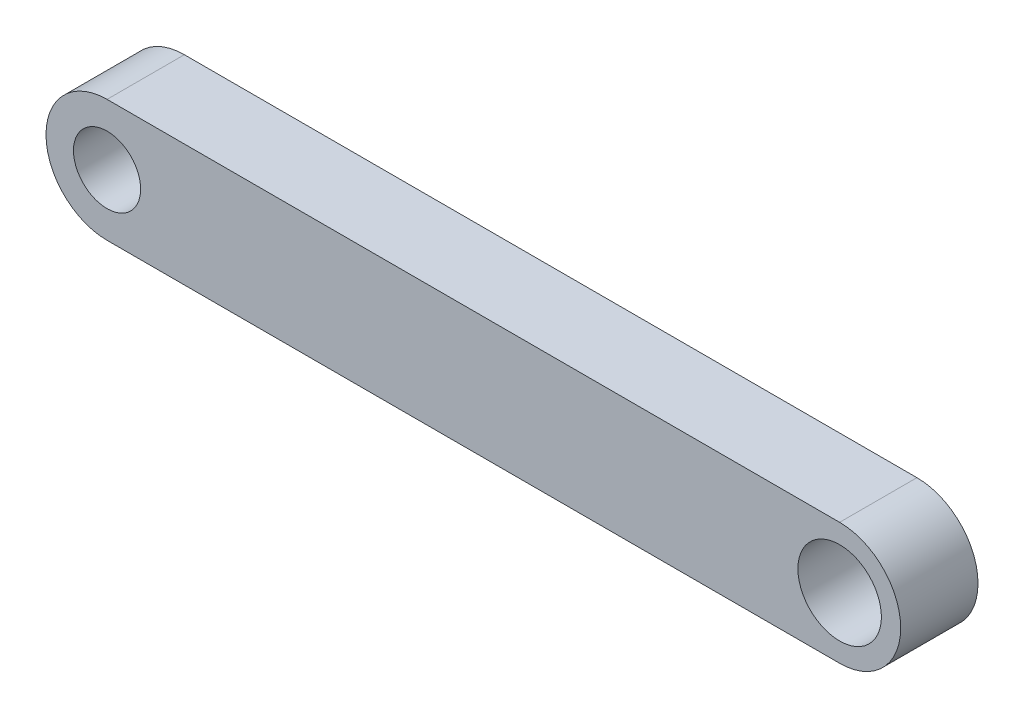
ISO-10303-21;
HEADER;
FILE_DESCRIPTION(('STEP AP214'),'2;1');
FILE_NAME('part.step','',(''),(''),'','','');
FILE_SCHEMA(('AUTOMOTIVE_DESIGN { 1 0 10303 214 1 1 1 1 }'));
ENDSEC;
DATA;
#1=APPLICATION_CONTEXT('core data for automotive mechanical design processes');
#2=APPLICATION_PROTOCOL_DEFINITION('international standard','automotive_design',2000,#1);
#3=PRODUCT_CONTEXT('',#1,'mechanical');
#4=PRODUCT('Part','Part','',(#3));
#5=PRODUCT_RELATED_PRODUCT_CATEGORY('part','',(#4));
#6=PRODUCT_DEFINITION_FORMATION('','',#4);
#7=PRODUCT_DEFINITION_CONTEXT('part definition',#1,'design');
#8=PRODUCT_DEFINITION('design','',#6,#7);
#9=PRODUCT_DEFINITION_SHAPE('','',#8);
#10=(LENGTH_UNIT() NAMED_UNIT(*) SI_UNIT(.MILLI.,.METRE.));
#11=(NAMED_UNIT(*) PLANE_ANGLE_UNIT() SI_UNIT($,.RADIAN.));
#12=(NAMED_UNIT(*) SI_UNIT($,.STERADIAN.) SOLID_ANGLE_UNIT());
#13=UNCERTAINTY_MEASURE_WITH_UNIT(LENGTH_MEASURE(1.E-05),#10,'distance_accuracy_value','');
#14=(GEOMETRIC_REPRESENTATION_CONTEXT(3) GLOBAL_UNCERTAINTY_ASSIGNED_CONTEXT((#13)) GLOBAL_UNIT_ASSIGNED_CONTEXT((#10,
#11,#12)) REPRESENTATION_CONTEXT('',''));
#15=CARTESIAN_POINT('',(0.,0.,0.));
#16=DIRECTION('',(0.,0.,1.));
#17=DIRECTION('',(1.,0.,0.));
#18=AXIS2_PLACEMENT_3D('',#15,#16,#17);
#19=CARTESIAN_POINT('',(-36.,0.,3.8));
#20=DIRECTION('',(0.,0.,-1.));
#21=DIRECTION('',(-1.,0.,0.));
#22=AXIS2_PLACEMENT_3D('',#19,#20,#21);
#23=PLANE('',#22);
#24=CARTESIAN_POINT('',(-36.,0.,3.8));
#25=DIRECTION('',(0.,0.,1.));
#26=DIRECTION('',(-1.,0.,0.));
#27=AXIS2_PLACEMENT_3D('',#24,#25,#26);
#28=CIRCLE('',#27,3.);
#29=CARTESIAN_POINT('',(-36.,3.,3.8));
#30=VERTEX_POINT('',#29);
#31=CARTESIAN_POINT('',(-36.,-3.,3.8));
#32=VERTEX_POINT('',#31);
#33=EDGE_CURVE('E98',#30,#32,#28,.T.);
#34=ORIENTED_EDGE('',*,*,#33,.T.);
#35=DIRECTION('',(1.,0.,0.));
#36=VECTOR('',#35,1.);
#37=CARTESIAN_POINT('',(0.,-3.,3.8));
#38=LINE('',#37,#36);
#39=CARTESIAN_POINT('',(0.,-3.,3.8));
#40=VERTEX_POINT('',#39);
#41=EDGE_CURVE('E93',#32,#40,#38,.T.);
#42=ORIENTED_EDGE('',*,*,#41,.T.);
#43=CARTESIAN_POINT('',(0.,0.,3.8));
#44=DIRECTION('',(0.,0.,1.));
#45=DIRECTION('',(1.,0.,0.));
#46=AXIS2_PLACEMENT_3D('',#43,#44,#45);
#47=CIRCLE('',#46,3.);
#48=CARTESIAN_POINT('',(0.,3.,3.8));
#49=VERTEX_POINT('',#48);
#50=EDGE_CURVE('E96',#40,#49,#47,.T.);
#51=ORIENTED_EDGE('',*,*,#50,.T.);
#52=DIRECTION('',(-1.,0.,0.));
#53=VECTOR('',#52,1.);
#54=CARTESIAN_POINT('',(0.,3.,3.8));
#55=LINE('',#54,#53);
#56=EDGE_CURVE('E63',#49,#30,#55,.T.);
#57=ORIENTED_EDGE('',*,*,#56,.T.);
#58=EDGE_LOOP('',(#34,#42,#51,#57));
#59=FACE_BOUND('',#58,.T.);
#60=CARTESIAN_POINT('',(0.,0.,3.8));
#61=DIRECTION('',(0.,0.,1.));
#62=DIRECTION('',(1.,0.,0.));
#63=AXIS2_PLACEMENT_3D('',#60,#61,#62);
#64=CIRCLE('',#63,2.05);
#65=CARTESIAN_POINT('',(-2.05,0.,3.8));
#66=VERTEX_POINT('',#65);
#67=EDGE_CURVE('E118',#66,#66,#64,.T.);
#68=ORIENTED_EDGE('',*,*,#67,.F.);
#69=EDGE_LOOP('',(#68));
#70=FACE_BOUND('',#69,.T.);
#71=CARTESIAN_POINT('',(-36.,0.,3.8));
#72=DIRECTION('',(0.,0.,1.));
#73=DIRECTION('',(-1.,0.,0.));
#74=AXIS2_PLACEMENT_3D('',#71,#72,#73);
#75=CIRCLE('',#74,1.65);
#76=CARTESIAN_POINT('',(-37.65,0.,3.8));
#77=VERTEX_POINT('',#76);
#78=EDGE_CURVE('E140',#77,#77,#75,.T.);
#79=ORIENTED_EDGE('',*,*,#78,.F.);
#80=EDGE_LOOP('',(#79));
#81=FACE_BOUND('',#80,.T.);
#82=ADVANCED_FACE('F45',(#59,#70,#81),#23,.F.);
#83=CARTESIAN_POINT('',(-36.,0.,0.));
#84=DIRECTION('',(0.,0.,-1.));
#85=DIRECTION('',(-1.,0.,0.));
#86=AXIS2_PLACEMENT_3D('',#83,#84,#85);
#87=PLANE('',#86);
#88=CARTESIAN_POINT('',(0.,0.,0.));
#89=DIRECTION('',(0.,0.,1.));
#90=DIRECTION('',(1.,0.,0.));
#91=AXIS2_PLACEMENT_3D('',#88,#89,#90);
#92=CIRCLE('',#91,2.05);
#93=CARTESIAN_POINT('',(-2.05,0.,0.));
#94=VERTEX_POINT('',#93);
#95=EDGE_CURVE('E136',#94,#94,#92,.T.);
#96=ORIENTED_EDGE('',*,*,#95,.T.);
#97=EDGE_LOOP('',(#96));
#98=FACE_BOUND('',#97,.T.);
#99=CARTESIAN_POINT('',(-36.,0.,0.));
#100=DIRECTION('',(0.,0.,1.));
#101=DIRECTION('',(-1.,0.,0.));
#102=AXIS2_PLACEMENT_3D('',#99,#100,#101);
#103=CIRCLE('',#102,3.);
#104=CARTESIAN_POINT('',(-36.,3.,0.));
#105=VERTEX_POINT('',#104);
#106=CARTESIAN_POINT('',(-36.,-3.,0.));
#107=VERTEX_POINT('',#106);
#108=EDGE_CURVE('E114',#105,#107,#103,.T.);
#109=ORIENTED_EDGE('',*,*,#108,.F.);
#110=DIRECTION('',(-1.,0.,0.));
#111=VECTOR('',#110,1.);
#112=CARTESIAN_POINT('',(0.,3.,0.));
#113=LINE('',#112,#111);
#114=CARTESIAN_POINT('',(0.,3.,0.));
#115=VERTEX_POINT('',#114);
#116=EDGE_CURVE('E86',#115,#105,#113,.T.);
#117=ORIENTED_EDGE('',*,*,#116,.F.);
#118=CARTESIAN_POINT('',(0.,0.,0.));
#119=DIRECTION('',(0.,0.,1.));
#120=DIRECTION('',(1.,0.,0.));
#121=AXIS2_PLACEMENT_3D('',#118,#119,#120);
#122=CIRCLE('',#121,3.);
#123=CARTESIAN_POINT('',(0.,-3.,0.));
#124=VERTEX_POINT('',#123);
#125=EDGE_CURVE('E80',#124,#115,#122,.T.);
#126=ORIENTED_EDGE('',*,*,#125,.F.);
#127=DIRECTION('',(1.,0.,0.));
#128=VECTOR('',#127,1.);
#129=CARTESIAN_POINT('',(0.,-3.,0.));
#130=LINE('',#129,#128);
#131=EDGE_CURVE('E103',#107,#124,#130,.T.);
#132=ORIENTED_EDGE('',*,*,#131,.F.);
#133=EDGE_LOOP('',(#109,#117,#126,#132));
#134=FACE_BOUND('',#133,.T.);
#135=CARTESIAN_POINT('',(-36.,0.,0.));
#136=DIRECTION('',(0.,0.,1.));
#137=DIRECTION('',(-1.,0.,0.));
#138=AXIS2_PLACEMENT_3D('',#135,#136,#137);
#139=CIRCLE('',#138,1.65);
#140=CARTESIAN_POINT('',(-37.65,0.,0.));
#141=VERTEX_POINT('',#140);
#142=EDGE_CURVE('E144',#141,#141,#139,.T.);
#143=ORIENTED_EDGE('',*,*,#142,.T.);
#144=EDGE_LOOP('',(#143));
#145=FACE_BOUND('',#144,.T.);
#146=ADVANCED_FACE('F131',(#98,#134,#145),#87,.T.);
#147=CARTESIAN_POINT('',(-36.,0.,3.8));
#148=DIRECTION('',(0.,0.,-1.));
#149=DIRECTION('',(-1.,0.,0.));
#150=AXIS2_PLACEMENT_3D('',#147,#148,#149);
#151=CYLINDRICAL_SURFACE('',#150,3.);
#152=ORIENTED_EDGE('',*,*,#108,.T.);
#153=DIRECTION('',(0.,0.,-1.));
#154=VECTOR('',#153,1.);
#155=CARTESIAN_POINT('',(-36.,-3.,3.8));
#156=LINE('',#155,#154);
#157=EDGE_CURVE('E11',#32,#107,#156,.T.);
#158=ORIENTED_EDGE('',*,*,#157,.F.);
#159=ORIENTED_EDGE('',*,*,#33,.F.);
#160=DIRECTION('',(0.,0.,-1.));
#161=VECTOR('',#160,1.);
#162=CARTESIAN_POINT('',(-36.,3.,3.8));
#163=LINE('',#162,#161);
#164=EDGE_CURVE('E110',#30,#105,#163,.T.);
#165=ORIENTED_EDGE('',*,*,#164,.T.);
#166=EDGE_LOOP('',(#152,#158,#159,#165));
#167=FACE_BOUND('',#166,.T.);
#168=ADVANCED_FACE('F47',(#167),#151,.T.);
#169=CARTESIAN_POINT('',(0.,-3.,3.8));
#170=DIRECTION('',(0.,1.,0.));
#171=DIRECTION('',(0.,0.,1.));
#172=AXIS2_PLACEMENT_3D('',#169,#170,#171);
#173=PLANE('',#172);
#174=ORIENTED_EDGE('',*,*,#131,.T.);
#175=DIRECTION('',(0.,0.,-1.));
#176=VECTOR('',#175,1.);
#177=CARTESIAN_POINT('',(0.,-3.,3.8));
#178=LINE('',#177,#176);
#179=EDGE_CURVE('E55',#40,#124,#178,.T.);
#180=ORIENTED_EDGE('',*,*,#179,.F.);
#181=ORIENTED_EDGE('',*,*,#41,.F.);
#182=ORIENTED_EDGE('',*,*,#157,.T.);
#183=EDGE_LOOP('',(#174,#180,#181,#182));
#184=FACE_BOUND('',#183,.T.);
#185=ADVANCED_FACE('F102',(#184),#173,.F.);
#186=CARTESIAN_POINT('',(0.,0.,3.8));
#187=DIRECTION('',(0.,0.,-1.));
#188=DIRECTION('',(-1.,0.,0.));
#189=AXIS2_PLACEMENT_3D('',#186,#187,#188);
#190=CYLINDRICAL_SURFACE('',#189,3.);
#191=ORIENTED_EDGE('',*,*,#125,.T.);
#192=DIRECTION('',(0.,0.,-1.));
#193=VECTOR('',#192,1.);
#194=CARTESIAN_POINT('',(0.,3.,3.8));
#195=LINE('',#194,#193);
#196=EDGE_CURVE('E105',#49,#115,#195,.T.);
#197=ORIENTED_EDGE('',*,*,#196,.F.);
#198=ORIENTED_EDGE('',*,*,#50,.F.);
#199=ORIENTED_EDGE('',*,*,#179,.T.);
#200=EDGE_LOOP('',(#191,#197,#198,#199));
#201=FACE_BOUND('',#200,.T.);
#202=ADVANCED_FACE('F106',(#201),#190,.T.);
#203=CARTESIAN_POINT('',(0.,3.,3.8));
#204=DIRECTION('',(0.,-1.,0.));
#205=DIRECTION('',(1.,0.,0.));
#206=AXIS2_PLACEMENT_3D('',#203,#204,#205);
#207=PLANE('',#206);
#208=ORIENTED_EDGE('',*,*,#116,.T.);
#209=ORIENTED_EDGE('',*,*,#164,.F.);
#210=ORIENTED_EDGE('',*,*,#56,.F.);
#211=ORIENTED_EDGE('',*,*,#196,.T.);
#212=EDGE_LOOP('',(#208,#209,#210,#211));
#213=FACE_BOUND('',#212,.T.);
#214=ADVANCED_FACE('F128',(#213),#207,.F.);
#215=CARTESIAN_POINT('',(0.,0.,3.8));
#216=DIRECTION('',(0.,0.,-1.));
#217=DIRECTION('',(-1.,0.,0.));
#218=AXIS2_PLACEMENT_3D('',#215,#216,#217);
#219=CYLINDRICAL_SURFACE('',#218,2.05);
#220=CARTESIAN_POINT('',(-2.05,0.,3.8));
#221=CARTESIAN_POINT('',(-2.05,0.,3.76041666666667));
#222=CARTESIAN_POINT('',(-2.05,0.,3.72083333333333));
#223=CARTESIAN_POINT('',(-2.05,0.,3.64166666666667));
#224=CARTESIAN_POINT('',(-2.05,0.,3.60208333333333));
#225=CARTESIAN_POINT('',(-2.05,0.,3.52291666666667));
#226=CARTESIAN_POINT('',(-2.05,0.,3.48333333333333));
#227=CARTESIAN_POINT('',(-2.05,0.,3.40416666666667));
#228=CARTESIAN_POINT('',(-2.05,0.,3.36458333333333));
#229=CARTESIAN_POINT('',(-2.05,0.,3.28541666666667));
#230=CARTESIAN_POINT('',(-2.05,0.,3.24583333333333));
#231=CARTESIAN_POINT('',(-2.05,0.,3.16666666666667));
#232=CARTESIAN_POINT('',(-2.05,0.,3.12708333333333));
#233=CARTESIAN_POINT('',(-2.05,0.,3.04791666666667));
#234=CARTESIAN_POINT('',(-2.05,0.,3.00833333333333));
#235=CARTESIAN_POINT('',(-2.05,0.,2.92916666666667));
#236=CARTESIAN_POINT('',(-2.05,0.,2.88958333333333));
#237=CARTESIAN_POINT('',(-2.05,0.,2.81041666666667));
#238=CARTESIAN_POINT('',(-2.05,0.,2.77083333333333));
#239=CARTESIAN_POINT('',(-2.05,0.,2.69166666666667));
#240=CARTESIAN_POINT('',(-2.05,0.,2.65208333333333));
#241=CARTESIAN_POINT('',(-2.05,0.,2.57291666666667));
#242=CARTESIAN_POINT('',(-2.05,0.,2.53333333333333));
#243=CARTESIAN_POINT('',(-2.05,0.,2.45416666666667));
#244=CARTESIAN_POINT('',(-2.05,0.,2.41458333333333));
#245=CARTESIAN_POINT('',(-2.05,0.,2.33541666666667));
#246=CARTESIAN_POINT('',(-2.05,0.,2.29583333333333));
#247=CARTESIAN_POINT('',(-2.05,0.,2.21666666666667));
#248=CARTESIAN_POINT('',(-2.05,0.,2.17708333333333));
#249=CARTESIAN_POINT('',(-2.05,0.,2.09791666666667));
#250=CARTESIAN_POINT('',(-2.05,0.,2.05833333333333));
#251=CARTESIAN_POINT('',(-2.05,0.,1.97916666666667));
#252=CARTESIAN_POINT('',(-2.05,0.,1.93958333333333));
#253=CARTESIAN_POINT('',(-2.05,0.,1.86041666666667));
#254=CARTESIAN_POINT('',(-2.05,0.,1.82083333333333));
#255=CARTESIAN_POINT('',(-2.05,0.,1.74166666666667));
#256=CARTESIAN_POINT('',(-2.05,0.,1.70208333333333));
#257=CARTESIAN_POINT('',(-2.05,0.,1.62291666666667));
#258=CARTESIAN_POINT('',(-2.05,0.,1.58333333333333));
#259=CARTESIAN_POINT('',(-2.05,0.,1.50416666666667));
#260=CARTESIAN_POINT('',(-2.05,0.,1.46458333333333));
#261=CARTESIAN_POINT('',(-2.05,0.,1.38541666666667));
#262=CARTESIAN_POINT('',(-2.05,0.,1.34583333333333));
#263=CARTESIAN_POINT('',(-2.05,0.,1.26666666666667));
#264=CARTESIAN_POINT('',(-2.05,0.,1.22708333333333));
#265=CARTESIAN_POINT('',(-2.05,0.,1.14791666666667));
#266=CARTESIAN_POINT('',(-2.05,0.,1.10833333333333));
#267=CARTESIAN_POINT('',(-2.05,0.,1.02916666666667));
#268=CARTESIAN_POINT('',(-2.05,0.,0.989583333333334));
#269=CARTESIAN_POINT('',(-2.05,0.,0.910416666666667));
#270=CARTESIAN_POINT('',(-2.05,0.,0.870833333333333));
#271=CARTESIAN_POINT('',(-2.05,0.,0.791666666666667));
#272=CARTESIAN_POINT('',(-2.05,0.,0.752083333333333));
#273=CARTESIAN_POINT('',(-2.05,0.,0.672916666666667));
#274=CARTESIAN_POINT('',(-2.05,0.,0.633333333333333));
#275=CARTESIAN_POINT('',(-2.05,0.,0.554166666666667));
#276=CARTESIAN_POINT('',(-2.05,0.,0.514583333333334));
#277=CARTESIAN_POINT('',(-2.05,0.,0.435416666666667));
#278=CARTESIAN_POINT('',(-2.05,0.,0.395833333333334));
#279=CARTESIAN_POINT('',(-2.05,0.,0.316666666666667));
#280=CARTESIAN_POINT('',(-2.05,0.,0.277083333333333));
#281=CARTESIAN_POINT('',(-2.05,0.,0.197916666666667));
#282=CARTESIAN_POINT('',(-2.05,0.,0.158333333333333));
#283=CARTESIAN_POINT('',(-2.05,0.,0.0791666666666666));
#284=CARTESIAN_POINT('',(-2.05,0.,0.0395833333333333));
#285=CARTESIAN_POINT('',(-2.05,0.,0.));
#286=B_SPLINE_CURVE_WITH_KNOTS('',3,(#220,#221,#222,#223,#224,#225,#226,#227,#228,#229,#230,
#231,#232,#233,#234,#235,#236,#237,#238,#239,#240,#241,#242,#243,#244,#245,#246,#247,#248,#249,
#250,#251,#252,#253,#254,#255,#256,#257,#258,#259,#260,#261,#262,#263,#264,#265,#266,#267,#268,
#269,#270,#271,#272,#273,#274,#275,#276,#277,#278,#279,#280,#281,#282,#283,#284,#285),
.UNSPECIFIED.,.F.,.F.,(4,2,2,2,2,2,2,2,2,2,2,2,2,2,2,2,2,2,2,2,2,2,2,2,2,2,2,2,2,2,2,2,4),(0.,
0.11875,0.2375,0.35625,0.475,0.59375,0.7125,0.83125,0.95,1.06875,1.1875,1.30625,1.425,1.54375,
1.6625,1.78125,1.9,2.01875,2.1375,2.25625,2.375,2.49375,2.6125,2.73125,2.85,2.96875,3.0875,
3.20625,3.325,3.44375,3.5625,3.68125,3.8),.UNSPECIFIED.);
#287=EDGE_CURVE('BSEAM163',#66,#94,#286,.T.);
#288=ORIENTED_EDGE('',*,*,#67,.T.);
#289=ORIENTED_EDGE('',*,*,#95,.F.);
#290=ORIENTED_EDGE('',*,*,#287,.T.);
#291=ORIENTED_EDGE('',*,*,#287,.F.);
#292=EDGE_LOOP('',(#288,#290,#289,#291));
#293=FACE_BOUND('',#292,.T.);
#294=ADVANCED_FACE('F163',(#293),#219,.F.);
#295=CARTESIAN_POINT('',(-36.,0.,3.8));
#296=DIRECTION('',(0.,0.,-1.));
#297=DIRECTION('',(-1.,0.,0.));
#298=AXIS2_PLACEMENT_3D('',#295,#296,#297);
#299=CYLINDRICAL_SURFACE('',#298,1.65);
#300=CARTESIAN_POINT('',(-37.65,0.,3.8));
#301=CARTESIAN_POINT('',(-37.65,0.,3.76041666666667));
#302=CARTESIAN_POINT('',(-37.65,0.,3.72083333333333));
#303=CARTESIAN_POINT('',(-37.65,0.,3.64166666666667));
#304=CARTESIAN_POINT('',(-37.65,0.,3.60208333333333));
#305=CARTESIAN_POINT('',(-37.65,0.,3.52291666666667));
#306=CARTESIAN_POINT('',(-37.65,0.,3.48333333333333));
#307=CARTESIAN_POINT('',(-37.65,0.,3.40416666666667));
#308=CARTESIAN_POINT('',(-37.65,0.,3.36458333333333));
#309=CARTESIAN_POINT('',(-37.65,0.,3.28541666666667));
#310=CARTESIAN_POINT('',(-37.65,0.,3.24583333333333));
#311=CARTESIAN_POINT('',(-37.65,0.,3.16666666666667));
#312=CARTESIAN_POINT('',(-37.65,0.,3.12708333333333));
#313=CARTESIAN_POINT('',(-37.65,0.,3.04791666666667));
#314=CARTESIAN_POINT('',(-37.65,0.,3.00833333333333));
#315=CARTESIAN_POINT('',(-37.65,0.,2.92916666666667));
#316=CARTESIAN_POINT('',(-37.65,0.,2.88958333333333));
#317=CARTESIAN_POINT('',(-37.65,0.,2.81041666666667));
#318=CARTESIAN_POINT('',(-37.65,0.,2.77083333333333));
#319=CARTESIAN_POINT('',(-37.65,0.,2.69166666666667));
#320=CARTESIAN_POINT('',(-37.65,0.,2.65208333333333));
#321=CARTESIAN_POINT('',(-37.65,0.,2.57291666666667));
#322=CARTESIAN_POINT('',(-37.65,0.,2.53333333333333));
#323=CARTESIAN_POINT('',(-37.65,0.,2.45416666666667));
#324=CARTESIAN_POINT('',(-37.65,0.,2.41458333333333));
#325=CARTESIAN_POINT('',(-37.65,0.,2.33541666666667));
#326=CARTESIAN_POINT('',(-37.65,0.,2.29583333333333));
#327=CARTESIAN_POINT('',(-37.65,0.,2.21666666666667));
#328=CARTESIAN_POINT('',(-37.65,0.,2.17708333333333));
#329=CARTESIAN_POINT('',(-37.65,0.,2.09791666666667));
#330=CARTESIAN_POINT('',(-37.65,0.,2.05833333333333));
#331=CARTESIAN_POINT('',(-37.65,0.,1.97916666666667));
#332=CARTESIAN_POINT('',(-37.65,0.,1.93958333333333));
#333=CARTESIAN_POINT('',(-37.65,0.,1.86041666666667));
#334=CARTESIAN_POINT('',(-37.65,0.,1.82083333333333));
#335=CARTESIAN_POINT('',(-37.65,0.,1.74166666666667));
#336=CARTESIAN_POINT('',(-37.65,0.,1.70208333333333));
#337=CARTESIAN_POINT('',(-37.65,0.,1.62291666666667));
#338=CARTESIAN_POINT('',(-37.65,0.,1.58333333333333));
#339=CARTESIAN_POINT('',(-37.65,0.,1.50416666666667));
#340=CARTESIAN_POINT('',(-37.65,0.,1.46458333333333));
#341=CARTESIAN_POINT('',(-37.65,0.,1.38541666666667));
#342=CARTESIAN_POINT('',(-37.65,0.,1.34583333333333));
#343=CARTESIAN_POINT('',(-37.65,0.,1.26666666666667));
#344=CARTESIAN_POINT('',(-37.65,0.,1.22708333333333));
#345=CARTESIAN_POINT('',(-37.65,0.,1.14791666666667));
#346=CARTESIAN_POINT('',(-37.65,0.,1.10833333333333));
#347=CARTESIAN_POINT('',(-37.65,0.,1.02916666666667));
#348=CARTESIAN_POINT('',(-37.65,0.,0.989583333333333));
#349=CARTESIAN_POINT('',(-37.65,0.,0.910416666666667));
#350=CARTESIAN_POINT('',(-37.65,0.,0.870833333333333));
#351=CARTESIAN_POINT('',(-37.65,0.,0.791666666666667));
#352=CARTESIAN_POINT('',(-37.65,0.,0.752083333333333));
#353=CARTESIAN_POINT('',(-37.65,0.,0.672916666666667));
#354=CARTESIAN_POINT('',(-37.65,0.,0.633333333333333));
#355=CARTESIAN_POINT('',(-37.65,0.,0.554166666666667));
#356=CARTESIAN_POINT('',(-37.65,0.,0.514583333333334));
#357=CARTESIAN_POINT('',(-37.65,0.,0.435416666666667));
#358=CARTESIAN_POINT('',(-37.65,0.,0.395833333333333));
#359=CARTESIAN_POINT('',(-37.65,0.,0.316666666666666));
#360=CARTESIAN_POINT('',(-37.65,0.,0.277083333333333));
#361=CARTESIAN_POINT('',(-37.65,0.,0.197916666666667));
#362=CARTESIAN_POINT('',(-37.65,0.,0.158333333333333));
#363=CARTESIAN_POINT('',(-37.65,0.,0.0791666666666666));
#364=CARTESIAN_POINT('',(-37.65,0.,0.0395833333333333));
#365=CARTESIAN_POINT('',(-37.65,0.,0.));
#366=B_SPLINE_CURVE_WITH_KNOTS('',3,(#300,#301,#302,#303,#304,#305,#306,#307,#308,#309,#310,
#311,#312,#313,#314,#315,#316,#317,#318,#319,#320,#321,#322,#323,#324,#325,#326,#327,#328,#329,
#330,#331,#332,#333,#334,#335,#336,#337,#338,#339,#340,#341,#342,#343,#344,#345,#346,#347,#348,
#349,#350,#351,#352,#353,#354,#355,#356,#357,#358,#359,#360,#361,#362,#363,#364,#365),
.UNSPECIFIED.,.F.,.F.,(4,2,2,2,2,2,2,2,2,2,2,2,2,2,2,2,2,2,2,2,2,2,2,2,2,2,2,2,2,2,2,2,4),(0.,
0.11875,0.2375,0.35625,0.475,0.59375,0.7125,0.831249999999999,0.95,1.06875,1.1875,1.30625,1.425,
1.54375,1.6625,1.78125,1.9,2.01875,2.1375,2.25625,2.375,2.49375,2.6125,2.73125,2.85,2.96875,
3.0875,3.20625,3.325,3.44375,3.5625,3.68125,3.8),.UNSPECIFIED.);
#367=EDGE_CURVE('BSEAM152',#77,#141,#366,.T.);
#368=ORIENTED_EDGE('',*,*,#78,.T.);
#369=ORIENTED_EDGE('',*,*,#142,.F.);
#370=ORIENTED_EDGE('',*,*,#367,.T.);
#371=ORIENTED_EDGE('',*,*,#367,.F.);
#372=EDGE_LOOP('',(#368,#370,#369,#371));
#373=FACE_BOUND('',#372,.T.);
#374=ADVANCED_FACE('F152',(#373),#299,.F.);
#375=CLOSED_SHELL('',(#82,#146,#168,#185,#202,#214,#294,#374));
#376=MANIFOLD_SOLID_BREP('B2',#375);
#377=ADVANCED_BREP_SHAPE_REPRESENTATION('',(#18,#376),#14);
#378=SHAPE_DEFINITION_REPRESENTATION(#9,#377);
ENDSEC;
END-ISO-10303-21;
